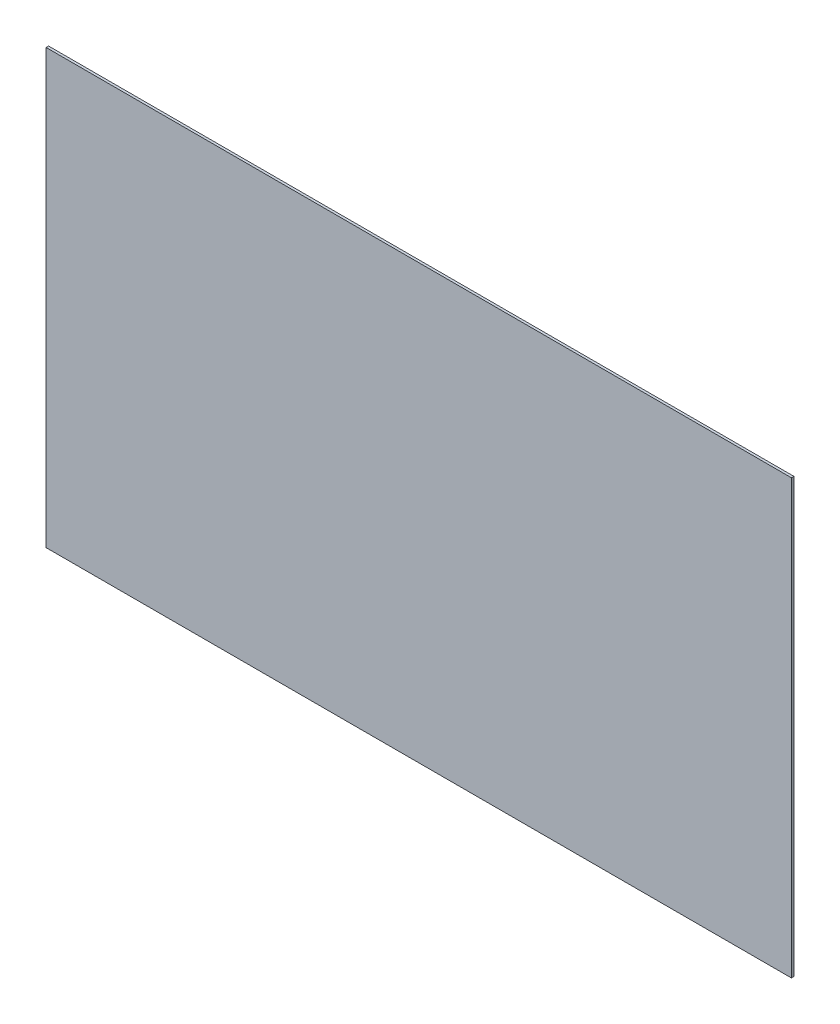
ISO-10303-21;
HEADER;
FILE_DESCRIPTION(('STEP AP214'),'2;1');
FILE_NAME('part.step','',(''),(''),'','','');
FILE_SCHEMA(('AUTOMOTIVE_DESIGN { 1 0 10303 214 1 1 1 1 }'));
ENDSEC;
DATA;
#1=APPLICATION_CONTEXT('core data for automotive mechanical design processes');
#2=APPLICATION_PROTOCOL_DEFINITION('international standard','automotive_design',2000,#1);
#3=PRODUCT_CONTEXT('',#1,'mechanical');
#4=PRODUCT('Part','Part','',(#3));
#5=PRODUCT_RELATED_PRODUCT_CATEGORY('part','',(#4));
#6=PRODUCT_DEFINITION_FORMATION('','',#4);
#7=PRODUCT_DEFINITION_CONTEXT('part definition',#1,'design');
#8=PRODUCT_DEFINITION('design','',#6,#7);
#9=PRODUCT_DEFINITION_SHAPE('','',#8);
#10=(LENGTH_UNIT() NAMED_UNIT(*) SI_UNIT(.MILLI.,.METRE.));
#11=(NAMED_UNIT(*) PLANE_ANGLE_UNIT() SI_UNIT($,.RADIAN.));
#12=(NAMED_UNIT(*) SI_UNIT($,.STERADIAN.) SOLID_ANGLE_UNIT());
#13=UNCERTAINTY_MEASURE_WITH_UNIT(LENGTH_MEASURE(1.E-05),#10,'distance_accuracy_value','');
#14=(GEOMETRIC_REPRESENTATION_CONTEXT(3) GLOBAL_UNCERTAINTY_ASSIGNED_CONTEXT((#13)) GLOBAL_UNIT_ASSIGNED_CONTEXT((#10,
#11,#12)) REPRESENTATION_CONTEXT('',''));
#15=CARTESIAN_POINT('',(0.,0.,0.));
#16=DIRECTION('',(0.,0.,1.));
#17=DIRECTION('',(1.,0.,0.));
#18=AXIS2_PLACEMENT_3D('',#15,#16,#17);
#19=CARTESIAN_POINT('',(600.5,-349.,4.));
#20=DIRECTION('',(-1.,0.,0.));
#21=DIRECTION('',(0.,0.,1.));
#22=AXIS2_PLACEMENT_3D('',#19,#20,#21);
#23=PLANE('',#22);
#24=DIRECTION('',(0.,1.,0.));
#25=VECTOR('',#24,1.);
#26=CARTESIAN_POINT('',(600.5,-349.,0.));
#27=LINE('',#26,#25);
#28=CARTESIAN_POINT('',(600.5,-349.,0.));
#29=VERTEX_POINT('',#28);
#30=CARTESIAN_POINT('',(600.5,349.,0.));
#31=VERTEX_POINT('',#30);
#32=EDGE_CURVE('E101',#29,#31,#27,.T.);
#33=ORIENTED_EDGE('',*,*,#32,.T.);
#34=DIRECTION('',(0.,0.,-1.));
#35=VECTOR('',#34,1.);
#36=CARTESIAN_POINT('',(600.5,349.,4.));
#37=LINE('',#36,#35);
#38=CARTESIAN_POINT('',(600.5,349.,4.));
#39=VERTEX_POINT('',#38);
#40=EDGE_CURVE('E11',#39,#31,#37,.T.);
#41=ORIENTED_EDGE('',*,*,#40,.F.);
#42=DIRECTION('',(0.,1.,0.));
#43=VECTOR('',#42,1.);
#44=CARTESIAN_POINT('',(600.5,-349.,4.));
#45=LINE('',#44,#43);
#46=CARTESIAN_POINT('',(600.5,-349.,4.));
#47=VERTEX_POINT('',#46);
#48=EDGE_CURVE('E89',#47,#39,#45,.T.);
#49=ORIENTED_EDGE('',*,*,#48,.F.);
#50=DIRECTION('',(0.,0.,-1.));
#51=VECTOR('',#50,1.);
#52=CARTESIAN_POINT('',(600.5,-349.,4.));
#53=LINE('',#52,#51);
#54=EDGE_CURVE('E97',#47,#29,#53,.T.);
#55=ORIENTED_EDGE('',*,*,#54,.T.);
#56=EDGE_LOOP('',(#33,#41,#49,#55));
#57=FACE_BOUND('',#56,.T.);
#58=ADVANCED_FACE('F38',(#57),#23,.F.);
#59=CARTESIAN_POINT('',(-600.5,349.,4.));
#60=DIRECTION('',(0.,-1.,0.));
#61=DIRECTION('',(0.,0.,-1.));
#62=AXIS2_PLACEMENT_3D('',#59,#60,#61);
#63=PLANE('',#62);
#64=DIRECTION('',(-1.,0.,0.));
#65=VECTOR('',#64,1.);
#66=CARTESIAN_POINT('',(-600.5,349.,0.));
#67=LINE('',#66,#65);
#68=CARTESIAN_POINT('',(-600.5,349.,0.));
#69=VERTEX_POINT('',#68);
#70=EDGE_CURVE('E93',#31,#69,#67,.T.);
#71=ORIENTED_EDGE('',*,*,#70,.T.);
#72=DIRECTION('',(0.,0.,-1.));
#73=VECTOR('',#72,1.);
#74=CARTESIAN_POINT('',(-600.5,349.,4.));
#75=LINE('',#74,#73);
#76=CARTESIAN_POINT('',(-600.5,349.,4.));
#77=VERTEX_POINT('',#76);
#78=EDGE_CURVE('E46',#77,#69,#75,.T.);
#79=ORIENTED_EDGE('',*,*,#78,.F.);
#80=DIRECTION('',(-1.,0.,0.));
#81=VECTOR('',#80,1.);
#82=CARTESIAN_POINT('',(-600.5,349.,4.));
#83=LINE('',#82,#81);
#84=EDGE_CURVE('E84',#39,#77,#83,.T.);
#85=ORIENTED_EDGE('',*,*,#84,.F.);
#86=ORIENTED_EDGE('',*,*,#40,.T.);
#87=EDGE_LOOP('',(#71,#79,#85,#86));
#88=FACE_BOUND('',#87,.T.);
#89=ADVANCED_FACE('F92',(#88),#63,.F.);
#90=CARTESIAN_POINT('',(-600.5,-349.,4.));
#91=DIRECTION('',(1.,0.,0.));
#92=DIRECTION('',(0.,0.,-1.));
#93=AXIS2_PLACEMENT_3D('',#90,#91,#92);
#94=PLANE('',#93);
#95=DIRECTION('',(0.,-1.,0.));
#96=VECTOR('',#95,1.);
#97=CARTESIAN_POINT('',(-600.5,-349.,0.));
#98=LINE('',#97,#96);
#99=CARTESIAN_POINT('',(-600.5,-349.,0.));
#100=VERTEX_POINT('',#99);
#101=EDGE_CURVE('E71',#69,#100,#98,.T.);
#102=ORIENTED_EDGE('',*,*,#101,.T.);
#103=DIRECTION('',(0.,0.,-1.));
#104=VECTOR('',#103,1.);
#105=CARTESIAN_POINT('',(-600.5,-349.,4.));
#106=LINE('',#105,#104);
#107=CARTESIAN_POINT('',(-600.5,-349.,4.));
#108=VERTEX_POINT('',#107);
#109=EDGE_CURVE('E94',#108,#100,#106,.T.);
#110=ORIENTED_EDGE('',*,*,#109,.F.);
#111=DIRECTION('',(0.,-1.,0.));
#112=VECTOR('',#111,1.);
#113=CARTESIAN_POINT('',(-600.5,-349.,4.));
#114=LINE('',#113,#112);
#115=EDGE_CURVE('E87',#77,#108,#114,.T.);
#116=ORIENTED_EDGE('',*,*,#115,.F.);
#117=ORIENTED_EDGE('',*,*,#78,.T.);
#118=EDGE_LOOP('',(#102,#110,#116,#117));
#119=FACE_BOUND('',#118,.T.);
#120=ADVANCED_FACE('F95',(#119),#94,.F.);
#121=CARTESIAN_POINT('',(-600.5,-349.,4.));
#122=DIRECTION('',(0.,1.,0.));
#123=DIRECTION('',(0.,0.,1.));
#124=AXIS2_PLACEMENT_3D('',#121,#122,#123);
#125=PLANE('',#124);
#126=DIRECTION('',(1.,0.,0.));
#127=VECTOR('',#126,1.);
#128=CARTESIAN_POINT('',(-600.5,-349.,0.));
#129=LINE('',#128,#127);
#130=EDGE_CURVE('E77',#100,#29,#129,.T.);
#131=ORIENTED_EDGE('',*,*,#130,.T.);
#132=ORIENTED_EDGE('',*,*,#54,.F.);
#133=DIRECTION('',(1.,0.,0.));
#134=VECTOR('',#133,1.);
#135=CARTESIAN_POINT('',(-600.5,-349.,4.));
#136=LINE('',#135,#134);
#137=EDGE_CURVE('E54',#108,#47,#136,.T.);
#138=ORIENTED_EDGE('',*,*,#137,.F.);
#139=ORIENTED_EDGE('',*,*,#109,.T.);
#140=EDGE_LOOP('',(#131,#132,#138,#139));
#141=FACE_BOUND('',#140,.T.);
#142=ADVANCED_FACE('F108',(#141),#125,.F.);
#143=CARTESIAN_POINT('',(0.,0.,4.));
#144=DIRECTION('',(0.,0.,-1.));
#145=DIRECTION('',(-1.,0.,0.));
#146=AXIS2_PLACEMENT_3D('',#143,#144,#145);
#147=PLANE('',#146);
#148=ORIENTED_EDGE('',*,*,#48,.T.);
#149=ORIENTED_EDGE('',*,*,#84,.T.);
#150=ORIENTED_EDGE('',*,*,#115,.T.);
#151=ORIENTED_EDGE('',*,*,#137,.T.);
#152=EDGE_LOOP('',(#148,#149,#150,#151));
#153=FACE_BOUND('',#152,.T.);
#154=ADVANCED_FACE('F85',(#153),#147,.F.);
#155=CARTESIAN_POINT('',(0.,0.,0.));
#156=DIRECTION('',(0.,0.,-1.));
#157=DIRECTION('',(-1.,0.,0.));
#158=AXIS2_PLACEMENT_3D('',#155,#156,#157);
#159=PLANE('',#158);
#160=ORIENTED_EDGE('',*,*,#32,.F.);
#161=ORIENTED_EDGE('',*,*,#130,.F.);
#162=ORIENTED_EDGE('',*,*,#101,.F.);
#163=ORIENTED_EDGE('',*,*,#70,.F.);
#164=EDGE_LOOP('',(#160,#161,#162,#163));
#165=FACE_BOUND('',#164,.T.);
#166=ADVANCED_FACE('F111',(#165),#159,.T.);
#167=CLOSED_SHELL('',(#58,#89,#120,#142,#154,#166));
#168=MANIFOLD_SOLID_BREP('B2',#167);
#169=ADVANCED_BREP_SHAPE_REPRESENTATION('',(#18,#168),#14);
#170=SHAPE_DEFINITION_REPRESENTATION(#9,#169);
ENDSEC;
END-ISO-10303-21;
